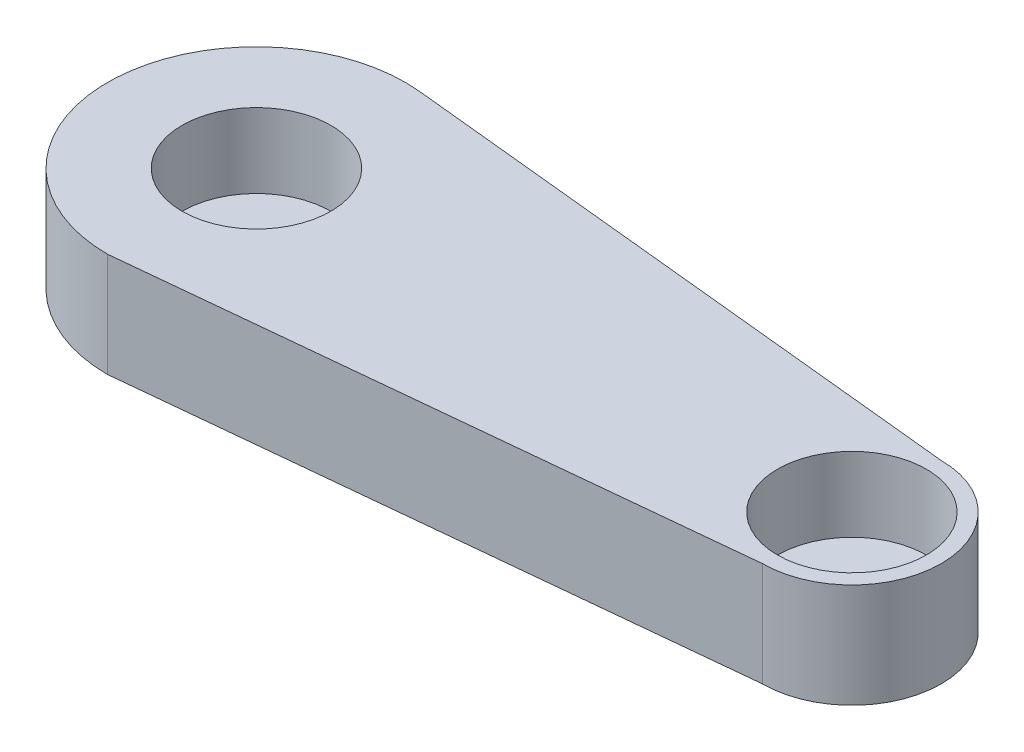
ISO-10303-21;
HEADER;
FILE_DESCRIPTION(('STEP AP214'),'2;1');
FILE_NAME('part.step','',(''),(''),'','','');
FILE_SCHEMA(('AUTOMOTIVE_DESIGN { 1 0 10303 214 1 1 1 1 }'));
ENDSEC;
DATA;
#1=APPLICATION_CONTEXT('core data for automotive mechanical design processes');
#2=APPLICATION_PROTOCOL_DEFINITION('international standard','automotive_design',2000,#1);
#3=PRODUCT_CONTEXT('',#1,'mechanical');
#4=PRODUCT('Part','Part','',(#3));
#5=PRODUCT_RELATED_PRODUCT_CATEGORY('part','',(#4));
#6=PRODUCT_DEFINITION_FORMATION('','',#4);
#7=PRODUCT_DEFINITION_CONTEXT('part definition',#1,'design');
#8=PRODUCT_DEFINITION('design','',#6,#7);
#9=PRODUCT_DEFINITION_SHAPE('','',#8);
#10=(LENGTH_UNIT() NAMED_UNIT(*) SI_UNIT(.MILLI.,.METRE.));
#11=(NAMED_UNIT(*) PLANE_ANGLE_UNIT() SI_UNIT($,.RADIAN.));
#12=(NAMED_UNIT(*) SI_UNIT($,.STERADIAN.) SOLID_ANGLE_UNIT());
#13=UNCERTAINTY_MEASURE_WITH_UNIT(LENGTH_MEASURE(1.E-05),#10,'distance_accuracy_value','');
#14=(GEOMETRIC_REPRESENTATION_CONTEXT(3) GLOBAL_UNCERTAINTY_ASSIGNED_CONTEXT((#13)) GLOBAL_UNIT_ASSIGNED_CONTEXT((#10,
#11,#12)) REPRESENTATION_CONTEXT('',''));
#15=CARTESIAN_POINT('',(0.,0.,0.));
#16=DIRECTION('',(0.,0.,1.));
#17=DIRECTION('',(1.,0.,0.));
#18=AXIS2_PLACEMENT_3D('',#15,#16,#17);
#19=CARTESIAN_POINT('',(8.86157817402349,70.,88.6157817402347));
#20=DIRECTION('',(-0.0995037190209991,0.,-0.995037190209989));
#21=DIRECTION('',(-0.995037190209989,0.,0.0995037190209991));
#22=AXIS2_PLACEMENT_3D('',#19,#20,#21);
#23=PLANE('',#22);
#24=DIRECTION('',(0.995037190209989,0.,-0.0995037190209991));
#25=VECTOR('',#24,1.);
#26=CARTESIAN_POINT('',(8.86157817402349,0.,88.6157817402347));
#27=LINE('',#26,#25);
#28=CARTESIAN_POINT('',(-104.980604423629,0.,100.));
#29=VERTEX_POINT('',#28);
#30=CARTESIAN_POINT('',(295.019395576371,0.,59.9999999999999));
#31=VERTEX_POINT('',#30);
#32=EDGE_CURVE('E97',#29,#31,#27,.T.);
#33=ORIENTED_EDGE('',*,*,#32,.T.);
#34=DIRECTION('',(0.,-1.,0.));
#35=VECTOR('',#34,1.);
#36=CARTESIAN_POINT('',(295.019395576371,70.,59.9999999999999));
#37=LINE('',#36,#35);
#38=CARTESIAN_POINT('',(295.019395576371,70.,59.9999999999999));
#39=VERTEX_POINT('',#38);
#40=EDGE_CURVE('E11',#39,#31,#37,.T.);
#41=ORIENTED_EDGE('',*,*,#40,.F.);
#42=DIRECTION('',(0.995037190209989,0.,-0.0995037190209991));
#43=VECTOR('',#42,1.);
#44=CARTESIAN_POINT('',(8.86157817402349,70.,88.6157817402347));
#45=LINE('',#44,#43);
#46=CARTESIAN_POINT('',(-104.980604423629,70.,100.));
#47=VERTEX_POINT('',#46);
#48=EDGE_CURVE('E82',#47,#39,#45,.T.);
#49=ORIENTED_EDGE('',*,*,#48,.F.);
#50=DIRECTION('',(0.,-1.,0.));
#51=VECTOR('',#50,1.);
#52=CARTESIAN_POINT('',(-104.980604423629,70.,100.));
#53=LINE('',#52,#51);
#54=EDGE_CURVE('E93',#47,#29,#53,.T.);
#55=ORIENTED_EDGE('',*,*,#54,.T.);
#56=EDGE_LOOP('',(#33,#41,#49,#55));
#57=FACE_BOUND('',#56,.T.);
#58=ADVANCED_FACE('F35',(#57),#23,.F.);
#59=CARTESIAN_POINT('',(295.019395576371,70.,0.));
#60=DIRECTION('',(0.,-1.,0.));
#61=DIRECTION('',(0.,0.,-1.));
#62=AXIS2_PLACEMENT_3D('',#59,#60,#61);
#63=CYLINDRICAL_SURFACE('',#62,59.9999999999999);
#64=CARTESIAN_POINT('',(295.019395576371,0.,0.));
#65=DIRECTION('',(0.,1.,0.));
#66=DIRECTION('',(0.,0.,1.));
#67=AXIS2_PLACEMENT_3D('',#64,#65,#66);
#68=CIRCLE('',#67,59.9999999999999);
#69=CARTESIAN_POINT('',(295.019395576371,0.,-59.9999999999999));
#70=VERTEX_POINT('',#69);
#71=EDGE_CURVE('E87',#31,#70,#68,.T.);
#72=ORIENTED_EDGE('',*,*,#71,.T.);
#73=DIRECTION('',(0.,-1.,0.));
#74=VECTOR('',#73,1.);
#75=CARTESIAN_POINT('',(295.019395576371,70.,-59.9999999999999));
#76=LINE('',#75,#74);
#77=CARTESIAN_POINT('',(295.019395576371,70.,-59.9999999999999));
#78=VERTEX_POINT('',#77);
#79=EDGE_CURVE('E43',#78,#70,#76,.T.);
#80=ORIENTED_EDGE('',*,*,#79,.F.);
#81=CARTESIAN_POINT('',(295.019395576371,70.,0.));
#82=DIRECTION('',(0.,1.,0.));
#83=DIRECTION('',(0.,0.,1.));
#84=AXIS2_PLACEMENT_3D('',#81,#82,#83);
#85=CIRCLE('',#84,59.9999999999999);
#86=EDGE_CURVE('E77',#39,#78,#85,.T.);
#87=ORIENTED_EDGE('',*,*,#86,.F.);
#88=ORIENTED_EDGE('',*,*,#40,.T.);
#89=EDGE_LOOP('',(#72,#80,#87,#88));
#90=FACE_BOUND('',#89,.T.);
#91=ADVANCED_FACE('F86',(#90),#63,.T.);
#92=CARTESIAN_POINT('',(9.01044733860151,70.,-88.9666733542364));
#93=DIRECTION('',(0.100763438076293,0.,-0.994910412824715));
#94=DIRECTION('',(-0.994910412824715,0.,-0.100763438076293));
#95=AXIS2_PLACEMENT_3D('',#92,#93,#94);
#96=PLANE('',#95);
#97=DIRECTION('',(0.994910412824715,0.,0.100763438076293));
#98=VECTOR('',#97,1.);
#99=CARTESIAN_POINT('',(9.01044733860151,0.,-88.9666733542364));
#100=LINE('',#99,#98);
#101=CARTESIAN_POINT('',(-94.904260616,0.,-99.4910412824715));
#102=VERTEX_POINT('',#101);
#103=EDGE_CURVE('E102',#102,#70,#100,.T.);
#104=ORIENTED_EDGE('',*,*,#103,.F.);
#105=DIRECTION('',(0.,-1.,0.));
#106=VECTOR('',#105,1.);
#107=CARTESIAN_POINT('',(-94.904260616,70.,-99.4910412824715));
#108=LINE('',#107,#106);
#109=CARTESIAN_POINT('',(-94.904260616,70.,-99.4910412824715));
#110=VERTEX_POINT('',#109);
#111=EDGE_CURVE('E67',#110,#102,#108,.T.);
#112=ORIENTED_EDGE('',*,*,#111,.F.);
#113=DIRECTION('',(0.994910412824715,0.,0.100763438076293));
#114=VECTOR('',#113,1.);
#115=CARTESIAN_POINT('',(9.01044733860151,70.,-88.9666733542364));
#116=LINE('',#115,#114);
#117=EDGE_CURVE('E80',#110,#78,#116,.T.);
#118=ORIENTED_EDGE('',*,*,#117,.T.);
#119=ORIENTED_EDGE('',*,*,#79,.T.);
#120=EDGE_LOOP('',(#104,#112,#118,#119));
#121=FACE_BOUND('',#120,.T.);
#122=ADVANCED_FACE('F91',(#121),#96,.T.);
#123=CARTESIAN_POINT('',(-104.980604423629,70.,0.));
#124=DIRECTION('',(0.,-1.,0.));
#125=DIRECTION('',(0.,0.,-1.));
#126=AXIS2_PLACEMENT_3D('',#123,#124,#125);
#127=CYLINDRICAL_SURFACE('',#126,100.);
#128=CARTESIAN_POINT('',(-104.980604423629,0.,0.));
#129=DIRECTION('',(0.,1.,0.));
#130=DIRECTION('',(0.,0.,1.));
#131=AXIS2_PLACEMENT_3D('',#128,#129,#130);
#132=CIRCLE('',#131,100.);
#133=EDGE_CURVE('E70',#102,#29,#132,.T.);
#134=ORIENTED_EDGE('',*,*,#133,.T.);
#135=ORIENTED_EDGE('',*,*,#54,.F.);
#136=CARTESIAN_POINT('',(-104.980604423629,70.,0.));
#137=DIRECTION('',(0.,1.,0.));
#138=DIRECTION('',(0.,0.,1.));
#139=AXIS2_PLACEMENT_3D('',#136,#137,#138);
#140=CIRCLE('',#139,100.);
#141=EDGE_CURVE('E51',#110,#47,#140,.T.);
#142=ORIENTED_EDGE('',*,*,#141,.F.);
#143=ORIENTED_EDGE('',*,*,#111,.T.);
#144=EDGE_LOOP('',(#134,#135,#142,#143));
#145=FACE_BOUND('',#144,.T.);
#146=ADVANCED_FACE('F120',(#145),#127,.T.);
#147=CARTESIAN_POINT('',(0.,70.,0.));
#148=DIRECTION('',(0.,1.,0.));
#149=DIRECTION('',(0.,0.,1.));
#150=AXIS2_PLACEMENT_3D('',#147,#148,#149);
#151=PLANE('',#150);
#152=CARTESIAN_POINT('',(295.019395576371,70.,0.));
#153=DIRECTION('',(0.,1.,0.));
#154=DIRECTION('',(0.,0.,1.));
#155=AXIS2_PLACEMENT_3D('',#152,#153,#154);
#156=CIRCLE('',#155,50.);
#157=CARTESIAN_POINT('',(295.019395576371,70.,50.));
#158=VERTEX_POINT('',#157);
#159=EDGE_CURVE('E186',#158,#158,#156,.T.);
#160=ORIENTED_EDGE('',*,*,#159,.F.);
#161=EDGE_LOOP('',(#160));
#162=FACE_BOUND('',#161,.T.);
#163=CARTESIAN_POINT('',(-104.980604423629,70.,0.));
#164=DIRECTION('',(0.,1.,0.));
#165=DIRECTION('',(0.,0.,1.));
#166=AXIS2_PLACEMENT_3D('',#163,#164,#165);
#167=CIRCLE('',#166,50.);
#168=CARTESIAN_POINT('',(-104.980604423629,70.,50.));
#169=VERTEX_POINT('',#168);
#170=EDGE_CURVE('E185',#169,#169,#167,.T.);
#171=ORIENTED_EDGE('',*,*,#170,.F.);
#172=EDGE_LOOP('',(#171));
#173=FACE_BOUND('',#172,.T.);
#174=ORIENTED_EDGE('',*,*,#48,.T.);
#175=ORIENTED_EDGE('',*,*,#86,.T.);
#176=ORIENTED_EDGE('',*,*,#117,.F.);
#177=ORIENTED_EDGE('',*,*,#141,.T.);
#178=EDGE_LOOP('',(#174,#175,#176,#177));
#179=FACE_BOUND('',#178,.T.);
#180=ADVANCED_FACE('F78',(#162,#173,#179),#151,.T.);
#181=CARTESIAN_POINT('',(0.,0.,0.));
#182=DIRECTION('',(0.,1.,0.));
#183=DIRECTION('',(0.,0.,1.));
#184=AXIS2_PLACEMENT_3D('',#181,#182,#183);
#185=PLANE('',#184);
#186=ORIENTED_EDGE('',*,*,#32,.F.);
#187=ORIENTED_EDGE('',*,*,#133,.F.);
#188=ORIENTED_EDGE('',*,*,#103,.T.);
#189=ORIENTED_EDGE('',*,*,#71,.F.);
#190=EDGE_LOOP('',(#186,#187,#188,#189));
#191=FACE_BOUND('',#190,.T.);
#192=ADVANCED_FACE('F109',(#191),#185,.F.);
#193=CARTESIAN_POINT('',(-104.980604423629,20.,0.));
#194=DIRECTION('',(0.,1.,0.));
#195=DIRECTION('',(0.,0.,1.));
#196=AXIS2_PLACEMENT_3D('',#193,#194,#195);
#197=CYLINDRICAL_SURFACE('',#196,50.);
#198=CARTESIAN_POINT('',(-104.980604423629,20.,0.));
#199=DIRECTION('',(0.,1.,0.));
#200=DIRECTION('',(0.,0.,1.));
#201=AXIS2_PLACEMENT_3D('',#198,#199,#200);
#202=CIRCLE('',#201,50.);
#203=CARTESIAN_POINT('',(-104.980604423629,20.,50.));
#204=VERTEX_POINT('',#203);
#205=EDGE_CURVE('E100',#204,#204,#202,.T.);
#206=ORIENTED_EDGE('',*,*,#205,.F.);
#207=EDGE_LOOP('',(#206));
#208=FACE_BOUND('',#207,.T.);
#209=ORIENTED_EDGE('',*,*,#170,.T.);
#210=EDGE_LOOP('',(#209));
#211=FACE_BOUND('',#210,.T.);
#212=ADVANCED_FACE('F111',(#208,#211),#197,.F.);
#213=CARTESIAN_POINT('',(-104.980604423629,20.,0.));
#214=DIRECTION('',(0.,1.,0.));
#215=DIRECTION('',(0.,0.,1.));
#216=AXIS2_PLACEMENT_3D('',#213,#214,#215);
#217=PLANE('',#216);
#218=ORIENTED_EDGE('',*,*,#205,.T.);
#219=EDGE_LOOP('',(#218));
#220=FACE_BOUND('',#219,.T.);
#221=ADVANCED_FACE('F117',(#220),#217,.T.);
#222=CARTESIAN_POINT('',(295.019395576371,20.,0.));
#223=DIRECTION('',(0.,1.,0.));
#224=DIRECTION('',(0.,0.,1.));
#225=AXIS2_PLACEMENT_3D('',#222,#223,#224);
#226=CYLINDRICAL_SURFACE('',#225,50.);
#227=CARTESIAN_POINT('',(295.019395576371,20.,0.));
#228=DIRECTION('',(0.,1.,0.));
#229=DIRECTION('',(0.,0.,1.));
#230=AXIS2_PLACEMENT_3D('',#227,#228,#229);
#231=CIRCLE('',#230,50.);
#232=CARTESIAN_POINT('',(295.019395576371,20.,50.));
#233=VERTEX_POINT('',#232);
#234=EDGE_CURVE('E184',#233,#233,#231,.T.);
#235=ORIENTED_EDGE('',*,*,#234,.F.);
#236=EDGE_LOOP('',(#235));
#237=FACE_BOUND('',#236,.T.);
#238=ORIENTED_EDGE('',*,*,#159,.T.);
#239=EDGE_LOOP('',(#238));
#240=FACE_BOUND('',#239,.T.);
#241=ADVANCED_FACE('F158',(#237,#240),#226,.F.);
#242=CARTESIAN_POINT('',(295.019395576371,20.,0.));
#243=DIRECTION('',(0.,1.,0.));
#244=DIRECTION('',(0.,0.,1.));
#245=AXIS2_PLACEMENT_3D('',#242,#243,#244);
#246=PLANE('',#245);
#247=ORIENTED_EDGE('',*,*,#234,.T.);
#248=EDGE_LOOP('',(#247));
#249=FACE_BOUND('',#248,.T.);
#250=ADVANCED_FACE('F168',(#249),#246,.T.);
#251=CLOSED_SHELL('',(#58,#91,#122,#146,#180,#192,#212,#221,#241,#250));
#252=MANIFOLD_SOLID_BREP('B2',#251);
#253=ADVANCED_BREP_SHAPE_REPRESENTATION('',(#18,#252),#14);
#254=SHAPE_DEFINITION_REPRESENTATION(#9,#253);
ENDSEC;
END-ISO-10303-21;
